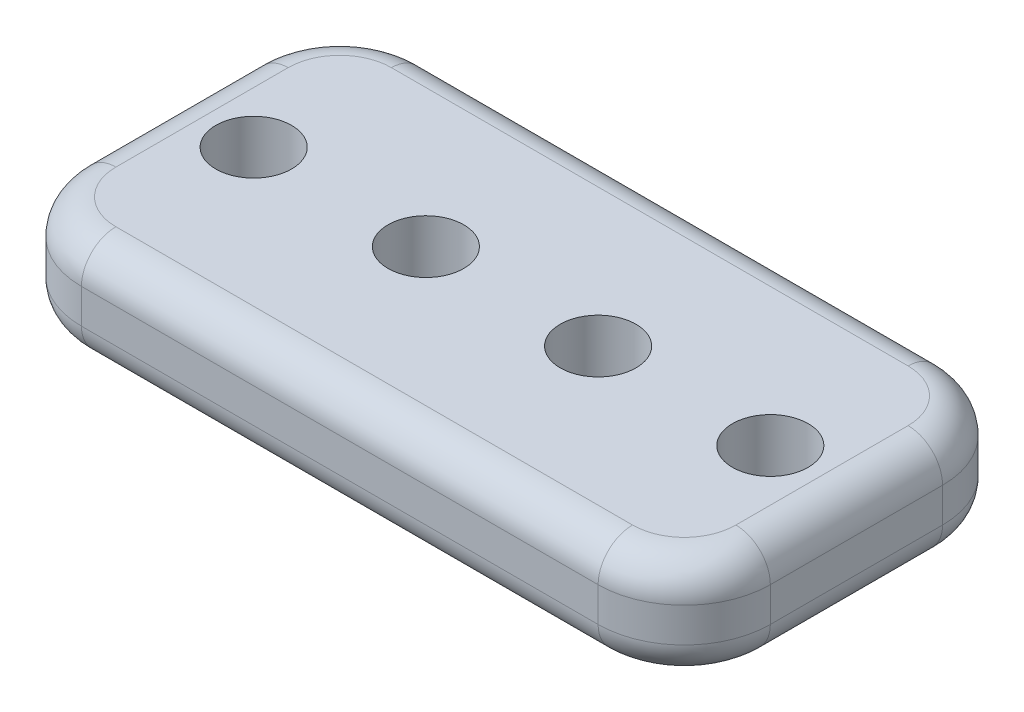
ISO-10303-21;
HEADER;
FILE_DESCRIPTION(('STEP AP214'),'2;1');
FILE_NAME('part.step','',(''),(''),'','','');
FILE_SCHEMA(('AUTOMOTIVE_DESIGN { 1 0 10303 214 1 1 1 1 }'));
ENDSEC;
DATA;
#1=APPLICATION_CONTEXT('core data for automotive mechanical design processes');
#2=APPLICATION_PROTOCOL_DEFINITION('international standard','automotive_design',2000,#1);
#3=PRODUCT_CONTEXT('',#1,'mechanical');
#4=PRODUCT('Part','Part','',(#3));
#5=PRODUCT_RELATED_PRODUCT_CATEGORY('part','',(#4));
#6=PRODUCT_DEFINITION_FORMATION('','',#4);
#7=PRODUCT_DEFINITION_CONTEXT('part definition',#1,'design');
#8=PRODUCT_DEFINITION('design','',#6,#7);
#9=PRODUCT_DEFINITION_SHAPE('','',#8);
#10=(LENGTH_UNIT() NAMED_UNIT(*) SI_UNIT(.MILLI.,.METRE.));
#11=(NAMED_UNIT(*) PLANE_ANGLE_UNIT() SI_UNIT($,.RADIAN.));
#12=(NAMED_UNIT(*) SI_UNIT($,.STERADIAN.) SOLID_ANGLE_UNIT());
#13=UNCERTAINTY_MEASURE_WITH_UNIT(LENGTH_MEASURE(1.E-05),#10,'distance_accuracy_value','');
#14=(GEOMETRIC_REPRESENTATION_CONTEXT(3) GLOBAL_UNCERTAINTY_ASSIGNED_CONTEXT((#13)) GLOBAL_UNIT_ASSIGNED_CONTEXT((#10,
#11,#12)) REPRESENTATION_CONTEXT('',''));
#15=CARTESIAN_POINT('',(0.,0.,0.));
#16=DIRECTION('',(0.,0.,1.));
#17=DIRECTION('',(1.,0.,0.));
#18=AXIS2_PLACEMENT_3D('',#15,#16,#17);
#19=CARTESIAN_POINT('',(7.5,3.,2.5));
#20=DIRECTION('',(0.,-1.,0.));
#21=DIRECTION('',(0.,0.,-1.));
#22=AXIS2_PLACEMENT_3D('',#19,#20,#21);
#23=CYLINDRICAL_SURFACE('',#22,2.5);
#24=DIRECTION('',(0.,-1.,0.));
#25=VECTOR('',#24,1.);
#26=CARTESIAN_POINT('',(7.5,3.,5.));
#27=LINE('',#26,#25);
#28=CARTESIAN_POINT('',(7.5,2.,5.));
#29=VERTEX_POINT('',#28);
#30=CARTESIAN_POINT('',(7.5,1.,5.));
#31=VERTEX_POINT('',#30);
#32=EDGE_CURVE('E309',#29,#31,#27,.T.);
#33=ORIENTED_EDGE('',*,*,#32,.T.);
#34=CARTESIAN_POINT('',(7.5,1.,2.5));
#35=DIRECTION('',(0.,1.,0.));
#36=DIRECTION('',(0.,0.,1.));
#37=AXIS2_PLACEMENT_3D('',#34,#35,#36);
#38=CIRCLE('',#37,2.5);
#39=CARTESIAN_POINT('',(9.99999999999999,1.,2.5));
#40=VERTEX_POINT('',#39);
#41=EDGE_CURVE('E368',#31,#40,#38,.T.);
#42=ORIENTED_EDGE('',*,*,#41,.T.);
#43=DIRECTION('',(0.,-1.,0.));
#44=VECTOR('',#43,1.);
#45=CARTESIAN_POINT('',(9.99999999999999,3.,2.5));
#46=LINE('',#45,#44);
#47=CARTESIAN_POINT('',(9.99999999999999,2.,2.5));
#48=VERTEX_POINT('',#47);
#49=EDGE_CURVE('E195',#48,#40,#46,.T.);
#50=ORIENTED_EDGE('',*,*,#49,.F.);
#51=CARTESIAN_POINT('',(7.5,2.,2.5));
#52=DIRECTION('',(0.,1.,0.));
#53=DIRECTION('',(0.,0.,1.));
#54=AXIS2_PLACEMENT_3D('',#51,#52,#53);
#55=CIRCLE('',#54,2.5);
#56=EDGE_CURVE('E365',#48,#29,#55,.F.);
#57=ORIENTED_EDGE('',*,*,#56,.T.);
#58=EDGE_LOOP('',(#33,#42,#50,#57));
#59=FACE_BOUND('',#58,.T.);
#60=ADVANCED_FACE('F45',(#59),#23,.T.);
#61=CARTESIAN_POINT('',(10.,3.,-2.5));
#62=DIRECTION('',(-1.,0.,0.));
#63=DIRECTION('',(0.,0.,1.));
#64=AXIS2_PLACEMENT_3D('',#61,#62,#63);
#65=PLANE('',#64);
#66=ORIENTED_EDGE('',*,*,#49,.T.);
#67=DIRECTION('',(0.,0.,-1.));
#68=VECTOR('',#67,1.);
#69=CARTESIAN_POINT('',(10.,1.,-2.5));
#70=LINE('',#69,#68);
#71=CARTESIAN_POINT('',(10.,1.,-2.5));
#72=VERTEX_POINT('',#71);
#73=EDGE_CURVE('E362',#40,#72,#70,.T.);
#74=ORIENTED_EDGE('',*,*,#73,.T.);
#75=DIRECTION('',(0.,-1.,0.));
#76=VECTOR('',#75,1.);
#77=CARTESIAN_POINT('',(10.,3.,-2.5));
#78=LINE('',#77,#76);
#79=CARTESIAN_POINT('',(10.,2.,-2.5));
#80=VERTEX_POINT('',#79);
#81=EDGE_CURVE('E185',#80,#72,#78,.T.);
#82=ORIENTED_EDGE('',*,*,#81,.F.);
#83=DIRECTION('',(0.,0.,-1.));
#84=VECTOR('',#83,1.);
#85=CARTESIAN_POINT('',(9.99999999999999,2.,2.5));
#86=LINE('',#85,#84);
#87=EDGE_CURVE('E359',#80,#48,#86,.F.);
#88=ORIENTED_EDGE('',*,*,#87,.T.);
#89=EDGE_LOOP('',(#66,#74,#82,#88));
#90=FACE_BOUND('',#89,.T.);
#91=ADVANCED_FACE('F470',(#90),#65,.F.);
#92=CARTESIAN_POINT('',(7.5,3.,-2.5));
#93=DIRECTION('',(0.,-1.,0.));
#94=DIRECTION('',(0.,0.,-1.));
#95=AXIS2_PLACEMENT_3D('',#92,#93,#94);
#96=CYLINDRICAL_SURFACE('',#95,2.5);
#97=ORIENTED_EDGE('',*,*,#81,.T.);
#98=CARTESIAN_POINT('',(7.5,1.,-2.5));
#99=DIRECTION('',(0.,1.,0.));
#100=DIRECTION('',(0.,0.,1.));
#101=AXIS2_PLACEMENT_3D('',#98,#99,#100);
#102=CIRCLE('',#101,2.5);
#103=CARTESIAN_POINT('',(7.5,1.,-5.));
#104=VERTEX_POINT('',#103);
#105=EDGE_CURVE('E183',#72,#104,#102,.T.);
#106=ORIENTED_EDGE('',*,*,#105,.T.);
#107=DIRECTION('',(0.,-1.,0.));
#108=VECTOR('',#107,1.);
#109=CARTESIAN_POINT('',(7.5,3.,-5.));
#110=LINE('',#109,#108);
#111=CARTESIAN_POINT('',(7.5,2.,-5.));
#112=VERTEX_POINT('',#111);
#113=EDGE_CURVE('E163',#112,#104,#110,.T.);
#114=ORIENTED_EDGE('',*,*,#113,.F.);
#115=CARTESIAN_POINT('',(7.5,2.,-2.5));
#116=DIRECTION('',(0.,1.,0.));
#117=DIRECTION('',(0.,0.,1.));
#118=AXIS2_PLACEMENT_3D('',#115,#116,#117);
#119=CIRCLE('',#118,2.5);
#120=EDGE_CURVE('E180',#112,#80,#119,.F.);
#121=ORIENTED_EDGE('',*,*,#120,.T.);
#122=EDGE_LOOP('',(#97,#106,#114,#121));
#123=FACE_BOUND('',#122,.T.);
#124=ADVANCED_FACE('F179',(#123),#96,.T.);
#125=CARTESIAN_POINT('',(-7.5,3.,-5.));
#126=DIRECTION('',(0.,0.,1.));
#127=DIRECTION('',(1.,0.,0.));
#128=AXIS2_PLACEMENT_3D('',#125,#126,#127);
#129=PLANE('',#128);
#130=ORIENTED_EDGE('',*,*,#113,.T.);
#131=DIRECTION('',(-1.,0.,0.));
#132=VECTOR('',#131,1.);
#133=CARTESIAN_POINT('',(-7.5,1.,-5.));
#134=LINE('',#133,#132);
#135=CARTESIAN_POINT('',(-7.5,1.,-5.));
#136=VERTEX_POINT('',#135);
#137=EDGE_CURVE('E171',#104,#136,#134,.T.);
#138=ORIENTED_EDGE('',*,*,#137,.T.);
#139=DIRECTION('',(0.,-1.,0.));
#140=VECTOR('',#139,1.);
#141=CARTESIAN_POINT('',(-7.5,3.,-5.));
#142=LINE('',#141,#140);
#143=CARTESIAN_POINT('',(-7.5,2.,-5.));
#144=VERTEX_POINT('',#143);
#145=EDGE_CURVE('E165',#144,#136,#142,.T.);
#146=ORIENTED_EDGE('',*,*,#145,.F.);
#147=DIRECTION('',(-1.,0.,0.));
#148=VECTOR('',#147,1.);
#149=CARTESIAN_POINT('',(7.5,2.,-5.));
#150=LINE('',#149,#148);
#151=EDGE_CURVE('E160',#144,#112,#150,.F.);
#152=ORIENTED_EDGE('',*,*,#151,.T.);
#153=EDGE_LOOP('',(#130,#138,#146,#152));
#154=FACE_BOUND('',#153,.T.);
#155=ADVANCED_FACE('F162',(#154),#129,.F.);
#156=CARTESIAN_POINT('',(-7.5,3.,-2.5));
#157=DIRECTION('',(0.,-1.,0.));
#158=DIRECTION('',(0.,0.,-1.));
#159=AXIS2_PLACEMENT_3D('',#156,#157,#158);
#160=CYLINDRICAL_SURFACE('',#159,2.5);
#161=ORIENTED_EDGE('',*,*,#145,.T.);
#162=CARTESIAN_POINT('',(-7.5,1.,-2.5));
#163=DIRECTION('',(0.,1.,0.));
#164=DIRECTION('',(0.,0.,1.));
#165=AXIS2_PLACEMENT_3D('',#162,#163,#164);
#166=CIRCLE('',#165,2.5);
#167=CARTESIAN_POINT('',(-10.,1.,-2.5));
#168=VERTEX_POINT('',#167);
#169=EDGE_CURVE('E172',#136,#168,#166,.T.);
#170=ORIENTED_EDGE('',*,*,#169,.T.);
#171=DIRECTION('',(0.,-1.,0.));
#172=VECTOR('',#171,1.);
#173=CARTESIAN_POINT('',(-10.,3.,-2.5));
#174=LINE('',#173,#172);
#175=CARTESIAN_POINT('',(-10.,2.,-2.5));
#176=VERTEX_POINT('',#175);
#177=EDGE_CURVE('E321',#176,#168,#174,.T.);
#178=ORIENTED_EDGE('',*,*,#177,.F.);
#179=CARTESIAN_POINT('',(-7.5,2.,-2.5));
#180=DIRECTION('',(0.,1.,0.));
#181=DIRECTION('',(0.,0.,1.));
#182=AXIS2_PLACEMENT_3D('',#179,#180,#181);
#183=CIRCLE('',#182,2.5);
#184=EDGE_CURVE('E389',#176,#144,#183,.F.);
#185=ORIENTED_EDGE('',*,*,#184,.T.);
#186=EDGE_LOOP('',(#161,#170,#178,#185));
#187=FACE_BOUND('',#186,.T.);
#188=ADVANCED_FACE('F596',(#187),#160,.T.);
#189=CARTESIAN_POINT('',(-10.,3.,-2.5));
#190=DIRECTION('',(1.,0.,0.));
#191=DIRECTION('',(0.,0.,-1.));
#192=AXIS2_PLACEMENT_3D('',#189,#190,#191);
#193=PLANE('',#192);
#194=ORIENTED_EDGE('',*,*,#177,.T.);
#195=DIRECTION('',(0.,0.,1.));
#196=VECTOR('',#195,1.);
#197=CARTESIAN_POINT('',(-10.,1.,-2.5));
#198=LINE('',#197,#196);
#199=CARTESIAN_POINT('',(-9.99999999999999,1.,2.5));
#200=VERTEX_POINT('',#199);
#201=EDGE_CURVE('E386',#168,#200,#198,.T.);
#202=ORIENTED_EDGE('',*,*,#201,.T.);
#203=DIRECTION('',(0.,-1.,0.));
#204=VECTOR('',#203,1.);
#205=CARTESIAN_POINT('',(-9.99999999999999,3.,2.5));
#206=LINE('',#205,#204);
#207=CARTESIAN_POINT('',(-9.99999999999999,2.,2.5));
#208=VERTEX_POINT('',#207);
#209=EDGE_CURVE('E317',#208,#200,#206,.T.);
#210=ORIENTED_EDGE('',*,*,#209,.F.);
#211=DIRECTION('',(0.,0.,1.));
#212=VECTOR('',#211,1.);
#213=CARTESIAN_POINT('',(-10.,2.,-2.5));
#214=LINE('',#213,#212);
#215=EDGE_CURVE('E383',#208,#176,#214,.F.);
#216=ORIENTED_EDGE('',*,*,#215,.T.);
#217=EDGE_LOOP('',(#194,#202,#210,#216));
#218=FACE_BOUND('',#217,.T.);
#219=ADVANCED_FACE('F436',(#218),#193,.F.);
#220=CARTESIAN_POINT('',(-7.5,3.,2.5));
#221=DIRECTION('',(0.,-1.,0.));
#222=DIRECTION('',(0.,0.,-1.));
#223=AXIS2_PLACEMENT_3D('',#220,#221,#222);
#224=CYLINDRICAL_SURFACE('',#223,2.5);
#225=ORIENTED_EDGE('',*,*,#209,.T.);
#226=CARTESIAN_POINT('',(-7.5,1.,2.5));
#227=DIRECTION('',(0.,1.,0.));
#228=DIRECTION('',(0.,0.,1.));
#229=AXIS2_PLACEMENT_3D('',#226,#227,#228);
#230=CIRCLE('',#229,2.5);
#231=CARTESIAN_POINT('',(-7.5,1.,5.));
#232=VERTEX_POINT('',#231);
#233=EDGE_CURVE('E380',#200,#232,#230,.T.);
#234=ORIENTED_EDGE('',*,*,#233,.T.);
#235=DIRECTION('',(0.,-1.,0.));
#236=VECTOR('',#235,1.);
#237=CARTESIAN_POINT('',(-7.5,3.,5.));
#238=LINE('',#237,#236);
#239=CARTESIAN_POINT('',(-7.5,2.,5.));
#240=VERTEX_POINT('',#239);
#241=EDGE_CURVE('E313',#240,#232,#238,.T.);
#242=ORIENTED_EDGE('',*,*,#241,.F.);
#243=CARTESIAN_POINT('',(-7.5,2.,2.5));
#244=DIRECTION('',(0.,1.,0.));
#245=DIRECTION('',(0.,0.,1.));
#246=AXIS2_PLACEMENT_3D('',#243,#244,#245);
#247=CIRCLE('',#246,2.5);
#248=EDGE_CURVE('E377',#240,#208,#247,.F.);
#249=ORIENTED_EDGE('',*,*,#248,.T.);
#250=EDGE_LOOP('',(#225,#234,#242,#249));
#251=FACE_BOUND('',#250,.T.);
#252=ADVANCED_FACE('F433',(#251),#224,.T.);
#253=CARTESIAN_POINT('',(-7.5,3.,5.));
#254=DIRECTION('',(0.,0.,-1.));
#255=DIRECTION('',(-1.,0.,0.));
#256=AXIS2_PLACEMENT_3D('',#253,#254,#255);
#257=PLANE('',#256);
#258=ORIENTED_EDGE('',*,*,#241,.T.);
#259=DIRECTION('',(1.,0.,0.));
#260=VECTOR('',#259,1.);
#261=CARTESIAN_POINT('',(-7.5,1.,5.));
#262=LINE('',#261,#260);
#263=EDGE_CURVE('E374',#232,#31,#262,.T.);
#264=ORIENTED_EDGE('',*,*,#263,.T.);
#265=ORIENTED_EDGE('',*,*,#32,.F.);
#266=DIRECTION('',(1.,0.,0.));
#267=VECTOR('',#266,1.);
#268=CARTESIAN_POINT('',(-7.5,2.,5.));
#269=LINE('',#268,#267);
#270=EDGE_CURVE('E371',#29,#240,#269,.F.);
#271=ORIENTED_EDGE('',*,*,#270,.T.);
#272=EDGE_LOOP('',(#258,#264,#265,#271));
#273=FACE_BOUND('',#272,.T.);
#274=ADVANCED_FACE('F453',(#273),#257,.F.);
#275=CARTESIAN_POINT('',(7.5,3.,2.5));
#276=DIRECTION('',(0.,1.,0.));
#277=DIRECTION('',(0.,0.,1.));
#278=AXIS2_PLACEMENT_3D('',#275,#276,#277);
#279=PLANE('',#278);
#280=DIRECTION('',(0.,0.,-1.));
#281=VECTOR('',#280,1.);
#282=CARTESIAN_POINT('',(9.,3.,-2.5));
#283=LINE('',#282,#281);
#284=CARTESIAN_POINT('',(9.,3.,2.5));
#285=VERTEX_POINT('',#284);
#286=CARTESIAN_POINT('',(9.,3.,-2.5));
#287=VERTEX_POINT('',#286);
#288=EDGE_CURVE('E55',#285,#287,#283,.T.);
#289=ORIENTED_EDGE('',*,*,#288,.T.);
#290=CARTESIAN_POINT('',(7.5,3.,-2.5));
#291=DIRECTION('',(0.,1.,0.));
#292=DIRECTION('',(0.,0.,1.));
#293=AXIS2_PLACEMENT_3D('',#290,#291,#292);
#294=CIRCLE('',#293,1.5);
#295=CARTESIAN_POINT('',(7.5,3.,-4.));
#296=VERTEX_POINT('',#295);
#297=EDGE_CURVE('E11',#287,#296,#294,.T.);
#298=ORIENTED_EDGE('',*,*,#297,.T.);
#299=DIRECTION('',(-1.,0.,0.));
#300=VECTOR('',#299,1.);
#301=CARTESIAN_POINT('',(-7.5,3.,-4.));
#302=LINE('',#301,#300);
#303=CARTESIAN_POINT('',(-7.5,3.,-4.));
#304=VERTEX_POINT('',#303);
#305=EDGE_CURVE('E198',#296,#304,#302,.T.);
#306=ORIENTED_EDGE('',*,*,#305,.T.);
#307=CARTESIAN_POINT('',(-7.5,3.,-2.5));
#308=DIRECTION('',(0.,1.,0.));
#309=DIRECTION('',(0.,0.,1.));
#310=AXIS2_PLACEMENT_3D('',#307,#308,#309);
#311=CIRCLE('',#310,1.5);
#312=CARTESIAN_POINT('',(-9.,3.,-2.5));
#313=VERTEX_POINT('',#312);
#314=EDGE_CURVE('E396',#304,#313,#311,.T.);
#315=ORIENTED_EDGE('',*,*,#314,.T.);
#316=DIRECTION('',(0.,0.,1.));
#317=VECTOR('',#316,1.);
#318=CARTESIAN_POINT('',(-8.99999999999999,3.,2.5));
#319=LINE('',#318,#317);
#320=CARTESIAN_POINT('',(-8.99999999999999,3.,2.5));
#321=VERTEX_POINT('',#320);
#322=EDGE_CURVE('E401',#313,#321,#319,.T.);
#323=ORIENTED_EDGE('',*,*,#322,.T.);
#324=CARTESIAN_POINT('',(-7.5,3.,2.5));
#325=DIRECTION('',(0.,1.,0.));
#326=DIRECTION('',(0.,0.,1.));
#327=AXIS2_PLACEMENT_3D('',#324,#325,#326);
#328=CIRCLE('',#327,1.5);
#329=CARTESIAN_POINT('',(-7.5,3.,4.));
#330=VERTEX_POINT('',#329);
#331=EDGE_CURVE('E404',#321,#330,#328,.T.);
#332=ORIENTED_EDGE('',*,*,#331,.T.);
#333=DIRECTION('',(1.,0.,0.));
#334=VECTOR('',#333,1.);
#335=CARTESIAN_POINT('',(7.5,3.,4.));
#336=LINE('',#335,#334);
#337=CARTESIAN_POINT('',(7.5,3.,4.));
#338=VERTEX_POINT('',#337);
#339=EDGE_CURVE('E407',#330,#338,#336,.T.);
#340=ORIENTED_EDGE('',*,*,#339,.T.);
#341=CARTESIAN_POINT('',(7.5,3.,2.5));
#342=DIRECTION('',(0.,1.,0.));
#343=DIRECTION('',(0.,0.,1.));
#344=AXIS2_PLACEMENT_3D('',#341,#342,#343);
#345=CIRCLE('',#344,1.5);
#346=EDGE_CURVE('E66',#338,#285,#345,.T.);
#347=ORIENTED_EDGE('',*,*,#346,.T.);
#348=EDGE_LOOP('',(#289,#298,#306,#315,#323,#332,#340,#347));
#349=FACE_BOUND('',#348,.T.);
#350=CARTESIAN_POINT('',(7.5,3.,0.));
#351=DIRECTION('',(0.,1.,0.));
#352=DIRECTION('',(0.,0.,1.));
#353=AXIS2_PLACEMENT_3D('',#350,#351,#352);
#354=CIRCLE('',#353,1.09999999999999);
#355=CARTESIAN_POINT('',(7.5,3.,1.09999999999999));
#356=VERTEX_POINT('',#355);
#357=EDGE_CURVE('E270',#356,#356,#354,.T.);
#358=ORIENTED_EDGE('',*,*,#357,.F.);
#359=EDGE_LOOP('',(#358));
#360=FACE_BOUND('',#359,.T.);
#361=CARTESIAN_POINT('',(2.5,3.,0.));
#362=DIRECTION('',(0.,1.,0.));
#363=DIRECTION('',(0.,0.,1.));
#364=AXIS2_PLACEMENT_3D('',#361,#362,#363);
#365=CIRCLE('',#364,1.09999999999999);
#366=CARTESIAN_POINT('',(2.5,3.,1.09999999999999));
#367=VERTEX_POINT('',#366);
#368=EDGE_CURVE('E283',#367,#367,#365,.T.);
#369=ORIENTED_EDGE('',*,*,#368,.F.);
#370=EDGE_LOOP('',(#369));
#371=FACE_BOUND('',#370,.T.);
#372=CARTESIAN_POINT('',(-7.5,3.,0.));
#373=DIRECTION('',(0.,1.,0.));
#374=DIRECTION('',(0.,0.,1.));
#375=AXIS2_PLACEMENT_3D('',#372,#373,#374);
#376=CIRCLE('',#375,1.09999999999999);
#377=CARTESIAN_POINT('',(-7.5,3.,1.09999999999999));
#378=VERTEX_POINT('',#377);
#379=EDGE_CURVE('E293',#378,#378,#376,.T.);
#380=ORIENTED_EDGE('',*,*,#379,.F.);
#381=EDGE_LOOP('',(#380));
#382=FACE_BOUND('',#381,.T.);
#383=CARTESIAN_POINT('',(-2.5,3.,0.));
#384=DIRECTION('',(0.,1.,0.));
#385=DIRECTION('',(0.,0.,1.));
#386=AXIS2_PLACEMENT_3D('',#383,#384,#385);
#387=CIRCLE('',#386,1.09999999999999);
#388=CARTESIAN_POINT('',(-2.5,3.,1.09999999999999));
#389=VERTEX_POINT('',#388);
#390=EDGE_CURVE('E301',#389,#389,#387,.T.);
#391=ORIENTED_EDGE('',*,*,#390,.F.);
#392=EDGE_LOOP('',(#391));
#393=FACE_BOUND('',#392,.T.);
#394=ADVANCED_FACE('F413',(#349,#360,#371,#382,#393),#279,.T.);
#395=CARTESIAN_POINT('',(7.5,0.,2.5));
#396=DIRECTION('',(0.,1.,0.));
#397=DIRECTION('',(0.,0.,1.));
#398=AXIS2_PLACEMENT_3D('',#395,#396,#397);
#399=PLANE('',#398);
#400=DIRECTION('',(-1.,0.,0.));
#401=VECTOR('',#400,1.);
#402=CARTESIAN_POINT('',(7.5,0.,-4.));
#403=LINE('',#402,#401);
#404=CARTESIAN_POINT('',(-7.5,0.,-4.));
#405=VERTEX_POINT('',#404);
#406=CARTESIAN_POINT('',(7.5,0.,-4.));
#407=VERTEX_POINT('',#406);
#408=EDGE_CURVE('E334',#405,#407,#403,.F.);
#409=ORIENTED_EDGE('',*,*,#408,.T.);
#410=CARTESIAN_POINT('',(7.5,0.,-2.5));
#411=DIRECTION('',(0.,1.,0.));
#412=DIRECTION('',(0.,0.,1.));
#413=AXIS2_PLACEMENT_3D('',#410,#411,#412);
#414=CIRCLE('',#413,1.5);
#415=CARTESIAN_POINT('',(9.,0.,-2.5));
#416=VERTEX_POINT('',#415);
#417=EDGE_CURVE('E355',#407,#416,#414,.F.);
#418=ORIENTED_EDGE('',*,*,#417,.T.);
#419=DIRECTION('',(0.,0.,-1.));
#420=VECTOR('',#419,1.);
#421=CARTESIAN_POINT('',(9.,0.,2.5));
#422=LINE('',#421,#420);
#423=CARTESIAN_POINT('',(9.,0.,2.5));
#424=VERTEX_POINT('',#423);
#425=EDGE_CURVE('E352',#416,#424,#422,.F.);
#426=ORIENTED_EDGE('',*,*,#425,.T.);
#427=CARTESIAN_POINT('',(7.5,0.,2.5));
#428=DIRECTION('',(0.,1.,0.));
#429=DIRECTION('',(0.,0.,1.));
#430=AXIS2_PLACEMENT_3D('',#427,#428,#429);
#431=CIRCLE('',#430,1.5);
#432=CARTESIAN_POINT('',(7.5,0.,4.));
#433=VERTEX_POINT('',#432);
#434=EDGE_CURVE('E349',#424,#433,#431,.F.);
#435=ORIENTED_EDGE('',*,*,#434,.T.);
#436=DIRECTION('',(1.,0.,0.));
#437=VECTOR('',#436,1.);
#438=CARTESIAN_POINT('',(7.5,0.,4.));
#439=LINE('',#438,#437);
#440=CARTESIAN_POINT('',(-7.5,0.,4.));
#441=VERTEX_POINT('',#440);
#442=EDGE_CURVE('E346',#433,#441,#439,.F.);
#443=ORIENTED_EDGE('',*,*,#442,.T.);
#444=CARTESIAN_POINT('',(-7.5,0.,2.5));
#445=DIRECTION('',(0.,1.,0.));
#446=DIRECTION('',(0.,0.,1.));
#447=AXIS2_PLACEMENT_3D('',#444,#445,#446);
#448=CIRCLE('',#447,1.5);
#449=CARTESIAN_POINT('',(-9.,0.,2.5));
#450=VERTEX_POINT('',#449);
#451=EDGE_CURVE('E343',#441,#450,#448,.F.);
#452=ORIENTED_EDGE('',*,*,#451,.T.);
#453=DIRECTION('',(0.,0.,1.));
#454=VECTOR('',#453,1.);
#455=CARTESIAN_POINT('',(-8.99999999999999,0.,2.50000000000001));
#456=LINE('',#455,#454);
#457=CARTESIAN_POINT('',(-9.,0.,-2.5));
#458=VERTEX_POINT('',#457);
#459=EDGE_CURVE('E340',#450,#458,#456,.F.);
#460=ORIENTED_EDGE('',*,*,#459,.T.);
#461=CARTESIAN_POINT('',(-7.5,0.,-2.5));
#462=DIRECTION('',(0.,1.,0.));
#463=DIRECTION('',(0.,0.,1.));
#464=AXIS2_PLACEMENT_3D('',#461,#462,#463);
#465=CIRCLE('',#464,1.5);
#466=EDGE_CURVE('E337',#458,#405,#465,.F.);
#467=ORIENTED_EDGE('',*,*,#466,.T.);
#468=EDGE_LOOP('',(#409,#418,#426,#435,#443,#452,#460,#467));
#469=FACE_BOUND('',#468,.T.);
#470=CARTESIAN_POINT('',(7.5,0.,0.));
#471=DIRECTION('',(0.,1.,0.));
#472=DIRECTION('',(0.,0.,1.));
#473=AXIS2_PLACEMENT_3D('',#470,#471,#472);
#474=CIRCLE('',#473,1.09999999999999);
#475=CARTESIAN_POINT('',(7.5,0.,1.09999999999999));
#476=VERTEX_POINT('',#475);
#477=EDGE_CURVE('E277',#476,#476,#474,.T.);
#478=ORIENTED_EDGE('',*,*,#477,.T.);
#479=EDGE_LOOP('',(#478));
#480=FACE_BOUND('',#479,.T.);
#481=CARTESIAN_POINT('',(2.5,0.,0.));
#482=DIRECTION('',(0.,1.,0.));
#483=DIRECTION('',(0.,0.,1.));
#484=AXIS2_PLACEMENT_3D('',#481,#482,#483);
#485=CIRCLE('',#484,1.09999999999999);
#486=CARTESIAN_POINT('',(2.5,0.,1.09999999999999));
#487=VERTEX_POINT('',#486);
#488=EDGE_CURVE('E289',#487,#487,#485,.T.);
#489=ORIENTED_EDGE('',*,*,#488,.T.);
#490=EDGE_LOOP('',(#489));
#491=FACE_BOUND('',#490,.T.);
#492=CARTESIAN_POINT('',(-7.5,0.,0.));
#493=DIRECTION('',(0.,1.,0.));
#494=DIRECTION('',(0.,0.,1.));
#495=AXIS2_PLACEMENT_3D('',#492,#493,#494);
#496=CIRCLE('',#495,1.09999999999999);
#497=CARTESIAN_POINT('',(-7.5,0.,1.09999999999999));
#498=VERTEX_POINT('',#497);
#499=EDGE_CURVE('E297',#498,#498,#496,.T.);
#500=ORIENTED_EDGE('',*,*,#499,.T.);
#501=EDGE_LOOP('',(#500));
#502=FACE_BOUND('',#501,.T.);
#503=CARTESIAN_POINT('',(-2.5,0.,0.));
#504=DIRECTION('',(0.,1.,0.));
#505=DIRECTION('',(0.,0.,1.));
#506=AXIS2_PLACEMENT_3D('',#503,#504,#505);
#507=CIRCLE('',#506,1.09999999999999);
#508=CARTESIAN_POINT('',(-2.5,0.,1.09999999999999));
#509=VERTEX_POINT('',#508);
#510=EDGE_CURVE('E305',#509,#509,#507,.T.);
#511=ORIENTED_EDGE('',*,*,#510,.T.);
#512=EDGE_LOOP('',(#511));
#513=FACE_BOUND('',#512,.T.);
#514=ADVANCED_FACE('F447',(#469,#480,#491,#502,#513),#399,.F.);
#515=CARTESIAN_POINT('',(-2.5,3.,0.));
#516=DIRECTION('',(0.,1.,0.));
#517=DIRECTION('',(0.,0.,1.));
#518=AXIS2_PLACEMENT_3D('',#515,#516,#517);
#519=CYLINDRICAL_SURFACE('',#518,1.09999999999999);
#520=ORIENTED_EDGE('',*,*,#510,.F.);
#521=EDGE_LOOP('',(#520));
#522=FACE_BOUND('',#521,.T.);
#523=ORIENTED_EDGE('',*,*,#390,.T.);
#524=EDGE_LOOP('',(#523));
#525=FACE_BOUND('',#524,.T.);
#526=ADVANCED_FACE('F566',(#522,#525),#519,.F.);
#527=CARTESIAN_POINT('',(-7.5,3.,0.));
#528=DIRECTION('',(0.,1.,0.));
#529=DIRECTION('',(0.,0.,1.));
#530=AXIS2_PLACEMENT_3D('',#527,#528,#529);
#531=CYLINDRICAL_SURFACE('',#530,1.09999999999999);
#532=ORIENTED_EDGE('',*,*,#499,.F.);
#533=EDGE_LOOP('',(#532));
#534=FACE_BOUND('',#533,.T.);
#535=ORIENTED_EDGE('',*,*,#379,.T.);
#536=EDGE_LOOP('',(#535));
#537=FACE_BOUND('',#536,.T.);
#538=ADVANCED_FACE('F642',(#534,#537),#531,.F.);
#539=CARTESIAN_POINT('',(2.5,3.,0.));
#540=DIRECTION('',(0.,1.,0.));
#541=DIRECTION('',(0.,0.,1.));
#542=AXIS2_PLACEMENT_3D('',#539,#540,#541);
#543=CYLINDRICAL_SURFACE('',#542,1.09999999999999);
#544=ORIENTED_EDGE('',*,*,#488,.F.);
#545=EDGE_LOOP('',(#544));
#546=FACE_BOUND('',#545,.T.);
#547=ORIENTED_EDGE('',*,*,#368,.T.);
#548=EDGE_LOOP('',(#547));
#549=FACE_BOUND('',#548,.T.);
#550=ADVANCED_FACE('F633',(#546,#549),#543,.F.);
#551=CARTESIAN_POINT('',(7.5,3.,0.));
#552=DIRECTION('',(0.,1.,0.));
#553=DIRECTION('',(0.,0.,1.));
#554=AXIS2_PLACEMENT_3D('',#551,#552,#553);
#555=CYLINDRICAL_SURFACE('',#554,1.09999999999999);
#556=ORIENTED_EDGE('',*,*,#477,.F.);
#557=EDGE_LOOP('',(#556));
#558=FACE_BOUND('',#557,.T.);
#559=ORIENTED_EDGE('',*,*,#357,.T.);
#560=EDGE_LOOP('',(#559));
#561=FACE_BOUND('',#560,.T.);
#562=ADVANCED_FACE('F500',(#558,#561),#555,.F.);
#563=CARTESIAN_POINT('',(-7.5,1.,2.5));
#564=DIRECTION('',(0.,1.,0.));
#565=DIRECTION('',(0.,0.,1.));
#566=AXIS2_PLACEMENT_3D('',#563,#564,#565);
#567=TOROIDAL_SURFACE('',#566,1.5,1.);
#568=CARTESIAN_POINT('',(-9.,1.,2.5));
#569=DIRECTION('',(0.,0.,-1.));
#570=DIRECTION('',(-1.,0.,0.));
#571=AXIS2_PLACEMENT_3D('',#568,#569,#570);
#572=CIRCLE('',#571,1.);
#573=EDGE_CURVE('E261',#450,#200,#572,.T.);
#574=ORIENTED_EDGE('',*,*,#573,.F.);
#575=ORIENTED_EDGE('',*,*,#451,.F.);
#576=CARTESIAN_POINT('',(-7.5,1.,4.));
#577=DIRECTION('',(1.,0.,0.));
#578=DIRECTION('',(0.,0.,-1.));
#579=AXIS2_PLACEMENT_3D('',#576,#577,#578);
#580=CIRCLE('',#579,1.);
#581=EDGE_CURVE('E205',#232,#441,#580,.T.);
#582=ORIENTED_EDGE('',*,*,#581,.F.);
#583=ORIENTED_EDGE('',*,*,#233,.F.);
#584=EDGE_LOOP('',(#574,#575,#582,#583));
#585=FACE_BOUND('',#584,.T.);
#586=ADVANCED_FACE('F451',(#585),#567,.T.);
#587=CARTESIAN_POINT('',(-7.5,1.,4.));
#588=DIRECTION('',(1.,0.,0.));
#589=DIRECTION('',(0.,0.,-1.));
#590=AXIS2_PLACEMENT_3D('',#587,#588,#589);
#591=CYLINDRICAL_SURFACE('',#590,1.);
#592=ORIENTED_EDGE('',*,*,#581,.T.);
#593=ORIENTED_EDGE('',*,*,#442,.F.);
#594=CARTESIAN_POINT('',(7.5,1.,4.));
#595=DIRECTION('',(1.,0.,0.));
#596=DIRECTION('',(0.,0.,-1.));
#597=AXIS2_PLACEMENT_3D('',#594,#595,#596);
#598=CIRCLE('',#597,1.);
#599=EDGE_CURVE('E258',#31,#433,#598,.T.);
#600=ORIENTED_EDGE('',*,*,#599,.F.);
#601=ORIENTED_EDGE('',*,*,#263,.F.);
#602=EDGE_LOOP('',(#592,#593,#600,#601));
#603=FACE_BOUND('',#602,.T.);
#604=ADVANCED_FACE('F459',(#603),#591,.T.);
#605=CARTESIAN_POINT('',(-9.,1.,-2.5));
#606=DIRECTION('',(0.,0.,1.));
#607=DIRECTION('',(1.,0.,0.));
#608=AXIS2_PLACEMENT_3D('',#605,#606,#607);
#609=CYLINDRICAL_SURFACE('',#608,1.);
#610=ORIENTED_EDGE('',*,*,#573,.T.);
#611=ORIENTED_EDGE('',*,*,#201,.F.);
#612=CARTESIAN_POINT('',(-9.,1.,-2.5));
#613=DIRECTION('',(0.,0.,-1.));
#614=DIRECTION('',(-1.,0.,0.));
#615=AXIS2_PLACEMENT_3D('',#612,#613,#614);
#616=CIRCLE('',#615,1.);
#617=EDGE_CURVE('E254',#458,#168,#616,.T.);
#618=ORIENTED_EDGE('',*,*,#617,.F.);
#619=ORIENTED_EDGE('',*,*,#459,.F.);
#620=EDGE_LOOP('',(#610,#611,#618,#619));
#621=FACE_BOUND('',#620,.T.);
#622=ADVANCED_FACE('F439',(#621),#609,.T.);
#623=CARTESIAN_POINT('',(7.5,1.,2.5));
#624=DIRECTION('',(0.,1.,0.));
#625=DIRECTION('',(0.,0.,1.));
#626=AXIS2_PLACEMENT_3D('',#623,#624,#625);
#627=TOROIDAL_SURFACE('',#626,1.5,1.);
#628=ORIENTED_EDGE('',*,*,#599,.T.);
#629=ORIENTED_EDGE('',*,*,#434,.F.);
#630=CARTESIAN_POINT('',(9.,1.,2.5));
#631=DIRECTION('',(0.,0.,-1.));
#632=DIRECTION('',(-1.,0.,0.));
#633=AXIS2_PLACEMENT_3D('',#630,#631,#632);
#634=CIRCLE('',#633,1.);
#635=EDGE_CURVE('E250',#40,#424,#634,.T.);
#636=ORIENTED_EDGE('',*,*,#635,.F.);
#637=ORIENTED_EDGE('',*,*,#41,.F.);
#638=EDGE_LOOP('',(#628,#629,#636,#637));
#639=FACE_BOUND('',#638,.T.);
#640=ADVANCED_FACE('F463',(#639),#627,.T.);
#641=CARTESIAN_POINT('',(-7.5,1.,-2.5));
#642=DIRECTION('',(0.,1.,0.));
#643=DIRECTION('',(0.,0.,1.));
#644=AXIS2_PLACEMENT_3D('',#641,#642,#643);
#645=TOROIDAL_SURFACE('',#644,1.5,1.);
#646=ORIENTED_EDGE('',*,*,#617,.T.);
#647=ORIENTED_EDGE('',*,*,#169,.F.);
#648=CARTESIAN_POINT('',(-7.5,1.,-4.));
#649=DIRECTION('',(1.,0.,0.));
#650=DIRECTION('',(0.,0.,-1.));
#651=AXIS2_PLACEMENT_3D('',#648,#649,#650);
#652=CIRCLE('',#651,1.);
#653=EDGE_CURVE('E243',#405,#136,#652,.T.);
#654=ORIENTED_EDGE('',*,*,#653,.F.);
#655=ORIENTED_EDGE('',*,*,#466,.F.);
#656=EDGE_LOOP('',(#646,#647,#654,#655));
#657=FACE_BOUND('',#656,.T.);
#658=ADVANCED_FACE('F443',(#657),#645,.T.);
#659=CARTESIAN_POINT('',(9.,1.,-2.5));
#660=DIRECTION('',(0.,0.,-1.));
#661=DIRECTION('',(-1.,0.,0.));
#662=AXIS2_PLACEMENT_3D('',#659,#660,#661);
#663=CYLINDRICAL_SURFACE('',#662,1.);
#664=ORIENTED_EDGE('',*,*,#635,.T.);
#665=ORIENTED_EDGE('',*,*,#425,.F.);
#666=CARTESIAN_POINT('',(9.,1.,-2.5));
#667=DIRECTION('',(0.,0.,-1.));
#668=DIRECTION('',(-1.,0.,0.));
#669=AXIS2_PLACEMENT_3D('',#666,#667,#668);
#670=CIRCLE('',#669,1.);
#671=EDGE_CURVE('E236',#72,#416,#670,.T.);
#672=ORIENTED_EDGE('',*,*,#671,.F.);
#673=ORIENTED_EDGE('',*,*,#73,.F.);
#674=EDGE_LOOP('',(#664,#665,#672,#673));
#675=FACE_BOUND('',#674,.T.);
#676=ADVANCED_FACE('F468',(#675),#663,.T.);
#677=CARTESIAN_POINT('',(-7.5,1.,-4.));
#678=DIRECTION('',(-1.,0.,0.));
#679=DIRECTION('',(0.,0.,1.));
#680=AXIS2_PLACEMENT_3D('',#677,#678,#679);
#681=CYLINDRICAL_SURFACE('',#680,1.);
#682=ORIENTED_EDGE('',*,*,#653,.T.);
#683=ORIENTED_EDGE('',*,*,#137,.F.);
#684=CARTESIAN_POINT('',(7.5,1.,-4.));
#685=DIRECTION('',(1.,0.,0.));
#686=DIRECTION('',(0.,0.,-1.));
#687=AXIS2_PLACEMENT_3D('',#684,#685,#686);
#688=CIRCLE('',#687,1.);
#689=EDGE_CURVE('E230',#407,#104,#688,.T.);
#690=ORIENTED_EDGE('',*,*,#689,.F.);
#691=ORIENTED_EDGE('',*,*,#408,.F.);
#692=EDGE_LOOP('',(#682,#683,#690,#691));
#693=FACE_BOUND('',#692,.T.);
#694=ADVANCED_FACE('F484',(#693),#681,.T.);
#695=CARTESIAN_POINT('',(7.5,1.,-2.5));
#696=DIRECTION('',(0.,1.,0.));
#697=DIRECTION('',(0.,0.,1.));
#698=AXIS2_PLACEMENT_3D('',#695,#696,#697);
#699=TOROIDAL_SURFACE('',#698,1.5,1.);
#700=ORIENTED_EDGE('',*,*,#671,.T.);
#701=ORIENTED_EDGE('',*,*,#417,.F.);
#702=ORIENTED_EDGE('',*,*,#689,.T.);
#703=ORIENTED_EDGE('',*,*,#105,.F.);
#704=EDGE_LOOP('',(#700,#701,#702,#703));
#705=FACE_BOUND('',#704,.T.);
#706=ADVANCED_FACE('F481',(#705),#699,.T.);
#707=CARTESIAN_POINT('',(-7.5,2.,2.5));
#708=DIRECTION('',(0.,1.,0.));
#709=DIRECTION('',(0.,0.,1.));
#710=AXIS2_PLACEMENT_3D('',#707,#708,#709);
#711=TOROIDAL_SURFACE('',#710,1.5,1.);
#712=CARTESIAN_POINT('',(-8.99999999999999,2.,2.5));
#713=DIRECTION('',(0.,0.,-1.));
#714=DIRECTION('',(-1.,0.,0.));
#715=AXIS2_PLACEMENT_3D('',#712,#713,#714);
#716=CIRCLE('',#715,1.);
#717=EDGE_CURVE('E221',#208,#321,#716,.T.);
#718=ORIENTED_EDGE('',*,*,#717,.F.);
#719=ORIENTED_EDGE('',*,*,#248,.F.);
#720=CARTESIAN_POINT('',(-7.5,2.,4.));
#721=DIRECTION('',(1.,0.,0.));
#722=DIRECTION('',(0.,0.,-1.));
#723=AXIS2_PLACEMENT_3D('',#720,#721,#722);
#724=CIRCLE('',#723,1.);
#725=EDGE_CURVE('E49',#330,#240,#724,.T.);
#726=ORIENTED_EDGE('',*,*,#725,.F.);
#727=ORIENTED_EDGE('',*,*,#331,.F.);
#728=EDGE_LOOP('',(#718,#719,#726,#727));
#729=FACE_BOUND('',#728,.T.);
#730=ADVANCED_FACE('F47',(#729),#711,.T.);
#731=CARTESIAN_POINT('',(7.5,2.,4.));
#732=DIRECTION('',(-1.,0.,0.));
#733=DIRECTION('',(0.,0.,1.));
#734=AXIS2_PLACEMENT_3D('',#731,#732,#733);
#735=CYLINDRICAL_SURFACE('',#734,1.);
#736=ORIENTED_EDGE('',*,*,#725,.T.);
#737=ORIENTED_EDGE('',*,*,#270,.F.);
#738=CARTESIAN_POINT('',(7.5,2.,4.));
#739=DIRECTION('',(1.,0.,0.));
#740=DIRECTION('',(0.,0.,-1.));
#741=AXIS2_PLACEMENT_3D('',#738,#739,#740);
#742=CIRCLE('',#741,1.);
#743=EDGE_CURVE('E218',#338,#29,#742,.T.);
#744=ORIENTED_EDGE('',*,*,#743,.F.);
#745=ORIENTED_EDGE('',*,*,#339,.F.);
#746=EDGE_LOOP('',(#736,#737,#744,#745));
#747=FACE_BOUND('',#746,.T.);
#748=ADVANCED_FACE('F416',(#747),#735,.T.);
#749=CARTESIAN_POINT('',(-8.99999999999999,2.,2.50000000000001));
#750=DIRECTION('',(0.,0.,-1.));
#751=DIRECTION('',(-1.,0.,0.));
#752=AXIS2_PLACEMENT_3D('',#749,#750,#751);
#753=CYLINDRICAL_SURFACE('',#752,1.);
#754=ORIENTED_EDGE('',*,*,#717,.T.);
#755=ORIENTED_EDGE('',*,*,#322,.F.);
#756=CARTESIAN_POINT('',(-9.,2.,-2.5));
#757=DIRECTION('',(0.,0.,-1.));
#758=DIRECTION('',(-1.,0.,0.));
#759=AXIS2_PLACEMENT_3D('',#756,#757,#758);
#760=CIRCLE('',#759,1.);
#761=EDGE_CURVE('E214',#176,#313,#760,.T.);
#762=ORIENTED_EDGE('',*,*,#761,.F.);
#763=ORIENTED_EDGE('',*,*,#215,.F.);
#764=EDGE_LOOP('',(#754,#755,#762,#763));
#765=FACE_BOUND('',#764,.T.);
#766=ADVANCED_FACE('F427',(#765),#753,.T.);
#767=CARTESIAN_POINT('',(7.5,2.,2.5));
#768=DIRECTION('',(0.,1.,0.));
#769=DIRECTION('',(0.,0.,1.));
#770=AXIS2_PLACEMENT_3D('',#767,#768,#769);
#771=TOROIDAL_SURFACE('',#770,1.5,1.);
#772=ORIENTED_EDGE('',*,*,#743,.T.);
#773=ORIENTED_EDGE('',*,*,#56,.F.);
#774=CARTESIAN_POINT('',(9.,2.,2.5));
#775=DIRECTION('',(0.,0.,-1.));
#776=DIRECTION('',(-1.,0.,0.));
#777=AXIS2_PLACEMENT_3D('',#774,#775,#776);
#778=CIRCLE('',#777,1.);
#779=EDGE_CURVE('E210',#285,#48,#778,.T.);
#780=ORIENTED_EDGE('',*,*,#779,.F.);
#781=ORIENTED_EDGE('',*,*,#346,.F.);
#782=EDGE_LOOP('',(#772,#773,#780,#781));
#783=FACE_BOUND('',#782,.T.);
#784=ADVANCED_FACE('F419',(#783),#771,.T.);
#785=CARTESIAN_POINT('',(-7.5,2.,-2.5));
#786=DIRECTION('',(0.,1.,0.));
#787=DIRECTION('',(0.,0.,1.));
#788=AXIS2_PLACEMENT_3D('',#785,#786,#787);
#789=TOROIDAL_SURFACE('',#788,1.5,1.);
#790=ORIENTED_EDGE('',*,*,#761,.T.);
#791=ORIENTED_EDGE('',*,*,#314,.F.);
#792=CARTESIAN_POINT('',(-7.5,2.,-4.));
#793=DIRECTION('',(1.,0.,0.));
#794=DIRECTION('',(0.,0.,-1.));
#795=AXIS2_PLACEMENT_3D('',#792,#793,#794);
#796=CIRCLE('',#795,1.);
#797=EDGE_CURVE('E202',#144,#304,#796,.T.);
#798=ORIENTED_EDGE('',*,*,#797,.F.);
#799=ORIENTED_EDGE('',*,*,#184,.F.);
#800=EDGE_LOOP('',(#790,#791,#798,#799));
#801=FACE_BOUND('',#800,.T.);
#802=ADVANCED_FACE('F424',(#801),#789,.T.);
#803=CARTESIAN_POINT('',(9.,2.,2.5));
#804=DIRECTION('',(0.,0.,1.));
#805=DIRECTION('',(1.,0.,0.));
#806=AXIS2_PLACEMENT_3D('',#803,#804,#805);
#807=CYLINDRICAL_SURFACE('',#806,1.);
#808=ORIENTED_EDGE('',*,*,#779,.T.);
#809=ORIENTED_EDGE('',*,*,#87,.F.);
#810=CARTESIAN_POINT('',(9.,2.,-2.5));
#811=DIRECTION('',(0.,0.,-1.));
#812=DIRECTION('',(-1.,0.,0.));
#813=AXIS2_PLACEMENT_3D('',#810,#811,#812);
#814=CIRCLE('',#813,1.);
#815=EDGE_CURVE('E192',#287,#80,#814,.T.);
#816=ORIENTED_EDGE('',*,*,#815,.F.);
#817=ORIENTED_EDGE('',*,*,#288,.F.);
#818=EDGE_LOOP('',(#808,#809,#816,#817));
#819=FACE_BOUND('',#818,.T.);
#820=ADVANCED_FACE('F421',(#819),#807,.T.);
#821=CARTESIAN_POINT('',(7.5,2.,-4.));
#822=DIRECTION('',(1.,0.,0.));
#823=DIRECTION('',(0.,0.,-1.));
#824=AXIS2_PLACEMENT_3D('',#821,#822,#823);
#825=CYLINDRICAL_SURFACE('',#824,1.);
#826=ORIENTED_EDGE('',*,*,#797,.T.);
#827=ORIENTED_EDGE('',*,*,#305,.F.);
#828=CARTESIAN_POINT('',(7.5,2.,-4.));
#829=DIRECTION('',(1.,0.,0.));
#830=DIRECTION('',(0.,0.,-1.));
#831=AXIS2_PLACEMENT_3D('',#828,#829,#830);
#832=CIRCLE('',#831,1.);
#833=EDGE_CURVE('E190',#112,#296,#832,.T.);
#834=ORIENTED_EDGE('',*,*,#833,.F.);
#835=ORIENTED_EDGE('',*,*,#151,.F.);
#836=EDGE_LOOP('',(#826,#827,#834,#835));
#837=FACE_BOUND('',#836,.T.);
#838=ADVANCED_FACE('F197',(#837),#825,.T.);
#839=CARTESIAN_POINT('',(7.5,2.,-2.5));
#840=DIRECTION('',(0.,1.,0.));
#841=DIRECTION('',(0.,0.,1.));
#842=AXIS2_PLACEMENT_3D('',#839,#840,#841);
#843=TOROIDAL_SURFACE('',#842,1.5,1.);
#844=ORIENTED_EDGE('',*,*,#815,.T.);
#845=ORIENTED_EDGE('',*,*,#120,.F.);
#846=ORIENTED_EDGE('',*,*,#833,.T.);
#847=ORIENTED_EDGE('',*,*,#297,.F.);
#848=EDGE_LOOP('',(#844,#845,#846,#847));
#849=FACE_BOUND('',#848,.T.);
#850=ADVANCED_FACE('F188',(#849),#843,.T.);
#851=CLOSED_SHELL('',(#60,#91,#124,#155,#188,#219,#252,#274,#394,#514,#526,#538,#550,#562,#586,
#604,#622,#640,#658,#676,#694,#706,#730,#748,#766,#784,#802,#820,#838,#850));
#852=MANIFOLD_SOLID_BREP('B2',#851);
#853=ADVANCED_BREP_SHAPE_REPRESENTATION('',(#18,#852),#14);
#854=SHAPE_DEFINITION_REPRESENTATION(#9,#853);
ENDSEC;
END-ISO-10303-21;
